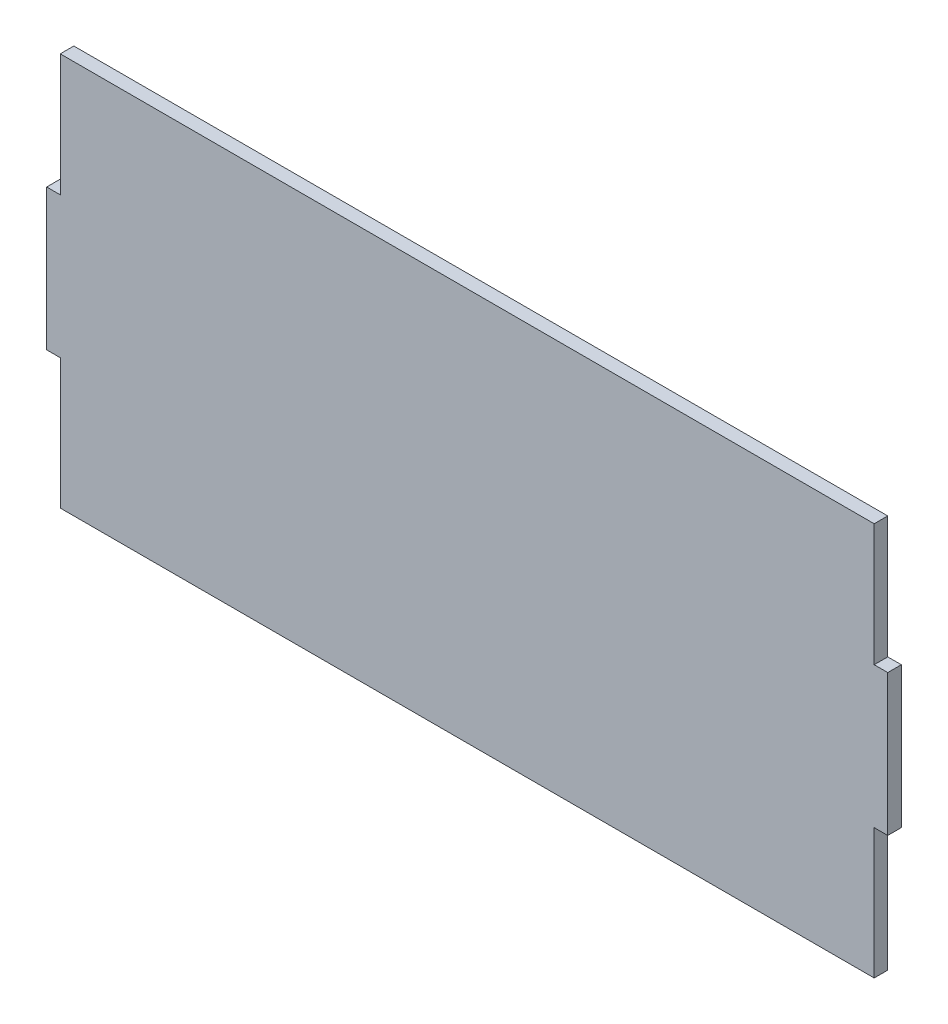
ISO-10303-21;
HEADER;
FILE_DESCRIPTION(('STEP AP214'),'2;1');
FILE_NAME('part.step','',(''),(''),'','','');
FILE_SCHEMA(('AUTOMOTIVE_DESIGN { 1 0 10303 214 1 1 1 1 }'));
ENDSEC;
DATA;
#1=APPLICATION_CONTEXT('core data for automotive mechanical design processes');
#2=APPLICATION_PROTOCOL_DEFINITION('international standard','automotive_design',2000,#1);
#3=PRODUCT_CONTEXT('',#1,'mechanical');
#4=PRODUCT('Part','Part','',(#3));
#5=PRODUCT_RELATED_PRODUCT_CATEGORY('part','',(#4));
#6=PRODUCT_DEFINITION_FORMATION('','',#4);
#7=PRODUCT_DEFINITION_CONTEXT('part definition',#1,'design');
#8=PRODUCT_DEFINITION('design','',#6,#7);
#9=PRODUCT_DEFINITION_SHAPE('','',#8);
#10=(LENGTH_UNIT() NAMED_UNIT(*) SI_UNIT(.MILLI.,.METRE.));
#11=(NAMED_UNIT(*) PLANE_ANGLE_UNIT() SI_UNIT($,.RADIAN.));
#12=(NAMED_UNIT(*) SI_UNIT($,.STERADIAN.) SOLID_ANGLE_UNIT());
#13=UNCERTAINTY_MEASURE_WITH_UNIT(LENGTH_MEASURE(1.E-05),#10,'distance_accuracy_value','');
#14=(GEOMETRIC_REPRESENTATION_CONTEXT(3) GLOBAL_UNCERTAINTY_ASSIGNED_CONTEXT((#13)) GLOBAL_UNIT_ASSIGNED_CONTEXT((#10,
#11,#12)) REPRESENTATION_CONTEXT('',''));
#15=CARTESIAN_POINT('',(0.,0.,0.));
#16=DIRECTION('',(0.,0.,1.));
#17=DIRECTION('',(1.,0.,0.));
#18=AXIS2_PLACEMENT_3D('',#15,#16,#17);
#19=CARTESIAN_POINT('',(0.,0.,5.));
#20=DIRECTION('',(-1.,0.,0.));
#21=DIRECTION('',(0.,-1.,0.));
#22=AXIS2_PLACEMENT_3D('',#19,#20,#21);
#23=PLANE('',#22);
#24=CARTESIAN_POINT('',(0.,-97.,5.));
#25=CARTESIAN_POINT('',(0.,-97.,0.));
#26=B_SPLINE_CURVE_WITH_KNOTS('',1,(#24,#25),.UNSPECIFIED.,.F.,.F.,(2,2),(0.,0.043859649122807),.UNSPECIFIED.);
#27=CARTESIAN_POINT('',(0.,-97.,5.));
#28=VERTEX_POINT('',#27);
#29=CARTESIAN_POINT('',(0.,-97.,0.));
#30=VERTEX_POINT('',#29);
#31=EDGE_CURVE('E103',#28,#30,#26,.T.);
#32=ORIENTED_EDGE('',*,*,#31,.F.);
#33=DIRECTION('',(0.,1.,0.));
#34=VECTOR('',#33,1.);
#35=CARTESIAN_POINT('',(0.,0.,5.));
#36=LINE('',#35,#34);
#37=CARTESIAN_POINT('',(0.,-145.,5.));
#38=VERTEX_POINT('',#37);
#39=EDGE_CURVE('E254',#38,#28,#36,.T.);
#40=ORIENTED_EDGE('',*,*,#39,.F.);
#41=DIRECTION('',(0.,0.,-1.));
#42=VECTOR('',#41,1.);
#43=CARTESIAN_POINT('',(0.,-145.,5.));
#44=LINE('',#43,#42);
#45=CARTESIAN_POINT('',(0.,-145.,0.));
#46=VERTEX_POINT('',#45);
#47=EDGE_CURVE('E265',#38,#46,#44,.T.);
#48=ORIENTED_EDGE('',*,*,#47,.T.);
#49=DIRECTION('',(0.,1.,0.));
#50=VECTOR('',#49,1.);
#51=CARTESIAN_POINT('',(0.,0.,0.));
#52=LINE('',#51,#50);
#53=EDGE_CURVE('E266',#46,#30,#52,.T.);
#54=ORIENTED_EDGE('',*,*,#53,.T.);
#55=EDGE_LOOP('',(#32,#40,#48,#54));
#56=FACE_BOUND('',#55,.T.);
#57=ADVANCED_FACE('F89',(#56),#23,.F.);
#58=CARTESIAN_POINT('',(0.,-45.,0.));
#59=CARTESIAN_POINT('',(0.,-45.,5.));
#60=B_SPLINE_CURVE_WITH_KNOTS('',1,(#58,#59),.UNSPECIFIED.,.F.,.F.,(2,2),(0.5,
0.543859649122807),.UNSPECIFIED.);
#61=CARTESIAN_POINT('',(0.,-45.,0.));
#62=VERTEX_POINT('',#61);
#63=CARTESIAN_POINT('',(0.,-45.,5.));
#64=VERTEX_POINT('',#63);
#65=EDGE_CURVE('E111',#62,#64,#60,.T.);
#66=ORIENTED_EDGE('',*,*,#65,.F.);
#67=CARTESIAN_POINT('',(0.,0.,0.));
#68=VERTEX_POINT('',#67);
#69=EDGE_CURVE('E226',#62,#68,#52,.T.);
#70=ORIENTED_EDGE('',*,*,#69,.T.);
#71=DIRECTION('',(0.,0.,-1.));
#72=VECTOR('',#71,1.);
#73=CARTESIAN_POINT('',(0.,0.,5.));
#74=LINE('',#73,#72);
#75=CARTESIAN_POINT('',(0.,0.,5.));
#76=VERTEX_POINT('',#75);
#77=EDGE_CURVE('E13',#76,#68,#74,.T.);
#78=ORIENTED_EDGE('',*,*,#77,.F.);
#79=EDGE_CURVE('E257',#64,#76,#36,.T.);
#80=ORIENTED_EDGE('',*,*,#79,.F.);
#81=EDGE_LOOP('',(#66,#70,#78,#80));
#82=FACE_BOUND('',#81,.T.);
#83=ADVANCED_FACE('F298',(#82),#23,.F.);
#84=CARTESIAN_POINT('',(-300.,0.,5.));
#85=DIRECTION('',(1.,0.,0.));
#86=DIRECTION('',(0.,1.,0.));
#87=AXIS2_PLACEMENT_3D('',#84,#85,#86);
#88=PLANE('',#87);
#89=CARTESIAN_POINT('',(-300.,-45.,5.));
#90=CARTESIAN_POINT('',(-300.,-45.,0.));
#91=B_SPLINE_CURVE_WITH_KNOTS('',1,(#89,#90),.UNSPECIFIED.,.F.,.F.,(2,2),(0.,0.043859649122807),.UNSPECIFIED.);
#92=CARTESIAN_POINT('',(-300.,-45.,5.));
#93=VERTEX_POINT('',#92);
#94=CARTESIAN_POINT('',(-300.,-45.,0.));
#95=VERTEX_POINT('',#94);
#96=EDGE_CURVE('E199',#93,#95,#91,.T.);
#97=ORIENTED_EDGE('',*,*,#96,.F.);
#98=DIRECTION('',(0.,-1.,0.));
#99=VECTOR('',#98,1.);
#100=CARTESIAN_POINT('',(-300.,0.,5.));
#101=LINE('',#100,#99);
#102=CARTESIAN_POINT('',(-300.,0.,5.));
#103=VERTEX_POINT('',#102);
#104=EDGE_CURVE('E260',#103,#93,#101,.T.);
#105=ORIENTED_EDGE('',*,*,#104,.F.);
#106=DIRECTION('',(0.,0.,-1.));
#107=VECTOR('',#106,1.);
#108=CARTESIAN_POINT('',(-300.,0.,5.));
#109=LINE('',#108,#107);
#110=CARTESIAN_POINT('',(-300.,0.,0.));
#111=VERTEX_POINT('',#110);
#112=EDGE_CURVE('E96',#103,#111,#109,.T.);
#113=ORIENTED_EDGE('',*,*,#112,.T.);
#114=DIRECTION('',(0.,-1.,0.));
#115=VECTOR('',#114,1.);
#116=CARTESIAN_POINT('',(-300.,0.,0.));
#117=LINE('',#116,#115);
#118=EDGE_CURVE('E271',#111,#95,#117,.T.);
#119=ORIENTED_EDGE('',*,*,#118,.T.);
#120=EDGE_LOOP('',(#97,#105,#113,#119));
#121=FACE_BOUND('',#120,.T.);
#122=ADVANCED_FACE('F284',(#121),#88,.F.);
#123=CARTESIAN_POINT('',(-300.,-97.,0.));
#124=CARTESIAN_POINT('',(-300.,-97.,5.));
#125=B_SPLINE_CURVE_WITH_KNOTS('',1,(#123,#124),.UNSPECIFIED.,.F.,.F.,(2,2),(0.5,
0.543859649122807),.UNSPECIFIED.);
#126=CARTESIAN_POINT('',(-300.,-97.,0.));
#127=VERTEX_POINT('',#126);
#128=CARTESIAN_POINT('',(-300.,-97.,5.));
#129=VERTEX_POINT('',#128);
#130=EDGE_CURVE('E202',#127,#129,#125,.T.);
#131=ORIENTED_EDGE('',*,*,#130,.F.);
#132=CARTESIAN_POINT('',(-300.,-145.,0.));
#133=VERTEX_POINT('',#132);
#134=EDGE_CURVE('E270',#127,#133,#117,.T.);
#135=ORIENTED_EDGE('',*,*,#134,.T.);
#136=DIRECTION('',(0.,0.,-1.));
#137=VECTOR('',#136,1.);
#138=CARTESIAN_POINT('',(-300.,-145.,5.));
#139=LINE('',#138,#137);
#140=CARTESIAN_POINT('',(-300.,-145.,5.));
#141=VERTEX_POINT('',#140);
#142=EDGE_CURVE('E277',#141,#133,#139,.T.);
#143=ORIENTED_EDGE('',*,*,#142,.F.);
#144=EDGE_CURVE('E259',#129,#141,#101,.T.);
#145=ORIENTED_EDGE('',*,*,#144,.F.);
#146=EDGE_LOOP('',(#131,#135,#143,#145));
#147=FACE_BOUND('',#146,.T.);
#148=ADVANCED_FACE('F322',(#147),#88,.F.);
#149=CARTESIAN_POINT('',(0.,0.,5.));
#150=DIRECTION('',(0.,-1.,0.));
#151=DIRECTION('',(0.,0.,-1.));
#152=AXIS2_PLACEMENT_3D('',#149,#150,#151);
#153=PLANE('',#152);
#154=DIRECTION('',(-1.,0.,0.));
#155=VECTOR('',#154,1.);
#156=CARTESIAN_POINT('',(0.,0.,0.));
#157=LINE('',#156,#155);
#158=EDGE_CURVE('E268',#68,#111,#157,.T.);
#159=ORIENTED_EDGE('',*,*,#158,.T.);
#160=ORIENTED_EDGE('',*,*,#112,.F.);
#161=DIRECTION('',(-1.,0.,0.));
#162=VECTOR('',#161,1.);
#163=CARTESIAN_POINT('',(0.,0.,5.));
#164=LINE('',#163,#162);
#165=EDGE_CURVE('E256',#76,#103,#164,.T.);
#166=ORIENTED_EDGE('',*,*,#165,.F.);
#167=ORIENTED_EDGE('',*,*,#77,.T.);
#168=EDGE_LOOP('',(#159,#160,#166,#167));
#169=FACE_BOUND('',#168,.T.);
#170=ADVANCED_FACE('F297',(#169),#153,.F.);
#171=CARTESIAN_POINT('',(0.,-145.,5.));
#172=DIRECTION('',(0.,1.,0.));
#173=DIRECTION('',(-1.,0.,0.));
#174=AXIS2_PLACEMENT_3D('',#171,#172,#173);
#175=PLANE('',#174);
#176=DIRECTION('',(1.,0.,0.));
#177=VECTOR('',#176,1.);
#178=CARTESIAN_POINT('',(0.,-145.,0.));
#179=LINE('',#178,#177);
#180=EDGE_CURVE('E273',#133,#46,#179,.T.);
#181=ORIENTED_EDGE('',*,*,#180,.T.);
#182=ORIENTED_EDGE('',*,*,#47,.F.);
#183=DIRECTION('',(1.,0.,0.));
#184=VECTOR('',#183,1.);
#185=CARTESIAN_POINT('',(0.,-145.,5.));
#186=LINE('',#185,#184);
#187=EDGE_CURVE('E263',#141,#38,#186,.T.);
#188=ORIENTED_EDGE('',*,*,#187,.F.);
#189=ORIENTED_EDGE('',*,*,#142,.T.);
#190=EDGE_LOOP('',(#181,#182,#188,#189));
#191=FACE_BOUND('',#190,.T.);
#192=ADVANCED_FACE('F330',(#191),#175,.F.);
#193=CARTESIAN_POINT('',(0.,0.,5.));
#194=DIRECTION('',(0.,0.,-1.));
#195=DIRECTION('',(-1.,0.,0.));
#196=AXIS2_PLACEMENT_3D('',#193,#194,#195);
#197=PLANE('',#196);
#198=ORIENTED_EDGE('',*,*,#39,.T.);
#199=DIRECTION('',(-1.,0.,0.));
#200=VECTOR('',#199,1.);
#201=CARTESIAN_POINT('',(9.99999999955322,-97.,5.));
#202=LINE('',#201,#200);
#203=CARTESIAN_POINT('',(5.00000000000207,-97.,5.));
#204=VERTEX_POINT('',#203);
#205=EDGE_CURVE('E190',#204,#28,#202,.T.);
#206=ORIENTED_EDGE('',*,*,#205,.F.);
#207=DIRECTION('',(0.,-1.,0.));
#208=VECTOR('',#207,1.);
#209=CARTESIAN_POINT('',(5.00000000000224,-45.,5.));
#210=LINE('',#209,#208);
#211=CARTESIAN_POINT('',(5.00000000000216,-45.,5.));
#212=VERTEX_POINT('',#211);
#213=EDGE_CURVE('E185',#212,#204,#210,.T.);
#214=ORIENTED_EDGE('',*,*,#213,.F.);
#215=DIRECTION('',(-1.,0.,0.));
#216=VECTOR('',#215,1.);
#217=CARTESIAN_POINT('',(9.99999999955322,-45.,5.));
#218=LINE('',#217,#216);
#219=EDGE_CURVE('E177',#212,#64,#218,.T.);
#220=ORIENTED_EDGE('',*,*,#219,.T.);
#221=ORIENTED_EDGE('',*,*,#79,.T.);
#222=ORIENTED_EDGE('',*,*,#165,.T.);
#223=ORIENTED_EDGE('',*,*,#104,.T.);
#224=DIRECTION('',(1.,0.,0.));
#225=VECTOR('',#224,1.);
#226=CARTESIAN_POINT('',(-309.999999999994,-45.,5.));
#227=LINE('',#226,#225);
#228=CARTESIAN_POINT('',(-304.999999999997,-45.,5.));
#229=VERTEX_POINT('',#228);
#230=EDGE_CURVE('E237',#229,#93,#227,.T.);
#231=ORIENTED_EDGE('',*,*,#230,.F.);
#232=DIRECTION('',(0.,-1.,0.));
#233=VECTOR('',#232,1.);
#234=CARTESIAN_POINT('',(-304.999999999997,-97.,5.));
#235=LINE('',#234,#233);
#236=CARTESIAN_POINT('',(-304.999999999997,-97.,5.));
#237=VERTEX_POINT('',#236);
#238=EDGE_CURVE('E221',#229,#237,#235,.T.);
#239=ORIENTED_EDGE('',*,*,#238,.T.);
#240=DIRECTION('',(1.,0.,0.));
#241=VECTOR('',#240,1.);
#242=CARTESIAN_POINT('',(-309.999999999994,-97.,5.));
#243=LINE('',#242,#241);
#244=EDGE_CURVE('E243',#237,#129,#243,.T.);
#245=ORIENTED_EDGE('',*,*,#244,.T.);
#246=ORIENTED_EDGE('',*,*,#144,.T.);
#247=ORIENTED_EDGE('',*,*,#187,.T.);
#248=EDGE_LOOP('',(#198,#206,#214,#220,#221,#222,#223,#231,#239,#245,#246,#247));
#249=FACE_BOUND('',#248,.T.);
#250=ADVANCED_FACE('F188',(#249),#197,.F.);
#251=CARTESIAN_POINT('',(0.,0.,0.));
#252=DIRECTION('',(0.,0.,-1.));
#253=DIRECTION('',(-1.,0.,0.));
#254=AXIS2_PLACEMENT_3D('',#251,#252,#253);
#255=PLANE('',#254);
#256=ORIENTED_EDGE('',*,*,#53,.F.);
#257=ORIENTED_EDGE('',*,*,#180,.F.);
#258=ORIENTED_EDGE('',*,*,#134,.F.);
#259=DIRECTION('',(1.,0.,0.));
#260=VECTOR('',#259,1.);
#261=CARTESIAN_POINT('',(-309.999999999994,-97.,0.));
#262=LINE('',#261,#260);
#263=CARTESIAN_POINT('',(-304.999999999997,-97.,0.));
#264=VERTEX_POINT('',#263);
#265=EDGE_CURVE('E246',#264,#127,#262,.T.);
#266=ORIENTED_EDGE('',*,*,#265,.F.);
#267=DIRECTION('',(0.,1.,0.));
#268=VECTOR('',#267,1.);
#269=CARTESIAN_POINT('',(-304.999999999997,-45.,0.));
#270=LINE('',#269,#268);
#271=CARTESIAN_POINT('',(-304.999999999997,-45.,0.));
#272=VERTEX_POINT('',#271);
#273=EDGE_CURVE('E220',#264,#272,#270,.T.);
#274=ORIENTED_EDGE('',*,*,#273,.T.);
#275=DIRECTION('',(1.,0.,0.));
#276=VECTOR('',#275,1.);
#277=CARTESIAN_POINT('',(-309.999999999994,-45.,0.));
#278=LINE('',#277,#276);
#279=EDGE_CURVE('E249',#272,#95,#278,.T.);
#280=ORIENTED_EDGE('',*,*,#279,.T.);
#281=ORIENTED_EDGE('',*,*,#118,.F.);
#282=ORIENTED_EDGE('',*,*,#158,.F.);
#283=ORIENTED_EDGE('',*,*,#69,.F.);
#284=DIRECTION('',(-1.,0.,0.));
#285=VECTOR('',#284,1.);
#286=CARTESIAN_POINT('',(9.99999999955322,-45.,0.));
#287=LINE('',#286,#285);
#288=CARTESIAN_POINT('',(5.00000000000224,-45.,0.));
#289=VERTEX_POINT('',#288);
#290=EDGE_CURVE('E214',#289,#62,#287,.T.);
#291=ORIENTED_EDGE('',*,*,#290,.F.);
#292=DIRECTION('',(0.,1.,0.));
#293=VECTOR('',#292,1.);
#294=CARTESIAN_POINT('',(5.00000000000207,-97.,0.));
#295=LINE('',#294,#293);
#296=CARTESIAN_POINT('',(5.00000000000216,-97.,0.));
#297=VERTEX_POINT('',#296);
#298=EDGE_CURVE('E198',#297,#289,#295,.T.);
#299=ORIENTED_EDGE('',*,*,#298,.F.);
#300=DIRECTION('',(-1.,0.,0.));
#301=VECTOR('',#300,1.);
#302=CARTESIAN_POINT('',(9.99999999955322,-97.,0.));
#303=LINE('',#302,#301);
#304=EDGE_CURVE('E211',#297,#30,#303,.T.);
#305=ORIENTED_EDGE('',*,*,#304,.T.);
#306=EDGE_LOOP('',(#256,#257,#258,#266,#274,#280,#281,#282,#283,#291,#299,#305));
#307=FACE_BOUND('',#306,.T.);
#308=ADVANCED_FACE('F290',(#307),#255,.T.);
#309=CARTESIAN_POINT('',(-309.999999999994,-97.,0.));
#310=DIRECTION('',(0.,1.,0.));
#311=DIRECTION('',(-1.,0.,0.));
#312=AXIS2_PLACEMENT_3D('',#309,#310,#311);
#313=PLANE('',#312);
#314=ORIENTED_EDGE('',*,*,#244,.F.);
#315=DIRECTION('',(0.,0.,-1.));
#316=VECTOR('',#315,1.);
#317=CARTESIAN_POINT('',(-304.999999999997,-97.,0.));
#318=LINE('',#317,#316);
#319=EDGE_CURVE('E217',#237,#264,#318,.T.);
#320=ORIENTED_EDGE('',*,*,#319,.T.);
#321=ORIENTED_EDGE('',*,*,#265,.T.);
#322=ORIENTED_EDGE('',*,*,#130,.T.);
#323=EDGE_LOOP('',(#314,#320,#321,#322));
#324=FACE_BOUND('',#323,.T.);
#325=ADVANCED_FACE('F348',(#324),#313,.F.);
#326=CARTESIAN_POINT('',(-309.999999999994,-45.,5.));
#327=DIRECTION('',(0.,-1.,0.));
#328=DIRECTION('',(1.,0.,0.));
#329=AXIS2_PLACEMENT_3D('',#326,#327,#328);
#330=PLANE('',#329);
#331=ORIENTED_EDGE('',*,*,#279,.F.);
#332=DIRECTION('',(0.,0.,1.));
#333=VECTOR('',#332,1.);
#334=CARTESIAN_POINT('',(-304.999999999997,-45.,5.));
#335=LINE('',#334,#333);
#336=EDGE_CURVE('E224',#272,#229,#335,.T.);
#337=ORIENTED_EDGE('',*,*,#336,.T.);
#338=ORIENTED_EDGE('',*,*,#230,.T.);
#339=ORIENTED_EDGE('',*,*,#96,.T.);
#340=EDGE_LOOP('',(#331,#337,#338,#339));
#341=FACE_BOUND('',#340,.T.);
#342=ADVANCED_FACE('F294',(#341),#330,.F.);
#343=CARTESIAN_POINT('',(-304.999999999997,-3.94129173741931E-12,299.999999999996));
#344=DIRECTION('',(1.,0.,0.));
#345=DIRECTION('',(0.,1.,0.));
#346=AXIS2_PLACEMENT_3D('',#343,#344,#345);
#347=PLANE('',#346);
#348=ORIENTED_EDGE('',*,*,#273,.F.);
#349=ORIENTED_EDGE('',*,*,#319,.F.);
#350=ORIENTED_EDGE('',*,*,#238,.F.);
#351=ORIENTED_EDGE('',*,*,#336,.F.);
#352=EDGE_LOOP('',(#348,#349,#350,#351));
#353=FACE_BOUND('',#352,.T.);
#354=ADVANCED_FACE('F303',(#353),#347,.F.);
#355=CARTESIAN_POINT('',(9.99999999955322,-97.,5.));
#356=DIRECTION('',(0.,1.,0.));
#357=DIRECTION('',(-1.,0.,0.));
#358=AXIS2_PLACEMENT_3D('',#355,#356,#357);
#359=PLANE('',#358);
#360=DIRECTION('',(0.,0.,-1.));
#361=VECTOR('',#360,1.);
#362=CARTESIAN_POINT('',(5.00000000000207,-97.,5.));
#363=LINE('',#362,#361);
#364=EDGE_CURVE('E194',#204,#297,#363,.T.);
#365=ORIENTED_EDGE('',*,*,#364,.F.);
#366=ORIENTED_EDGE('',*,*,#205,.T.);
#367=ORIENTED_EDGE('',*,*,#31,.T.);
#368=ORIENTED_EDGE('',*,*,#304,.F.);
#369=EDGE_LOOP('',(#365,#366,#367,#368));
#370=FACE_BOUND('',#369,.T.);
#371=ADVANCED_FACE('F301',(#370),#359,.F.);
#372=CARTESIAN_POINT('',(9.99999999955322,-45.,0.));
#373=DIRECTION('',(0.,-1.,0.));
#374=DIRECTION('',(1.,0.,0.));
#375=AXIS2_PLACEMENT_3D('',#372,#373,#374);
#376=PLANE('',#375);
#377=DIRECTION('',(0.,0.,1.));
#378=VECTOR('',#377,1.);
#379=CARTESIAN_POINT('',(5.00000000000224,-45.,0.));
#380=LINE('',#379,#378);
#381=EDGE_CURVE('E182',#289,#212,#380,.T.);
#382=ORIENTED_EDGE('',*,*,#381,.F.);
#383=ORIENTED_EDGE('',*,*,#290,.T.);
#384=ORIENTED_EDGE('',*,*,#65,.T.);
#385=ORIENTED_EDGE('',*,*,#219,.F.);
#386=EDGE_LOOP('',(#382,#383,#384,#385));
#387=FACE_BOUND('',#386,.T.);
#388=ADVANCED_FACE('F179',(#387),#376,.F.);
#389=CARTESIAN_POINT('',(5.00000000000242,-3.73562962286199E-12,299.999999999996));
#390=DIRECTION('',(1.,0.,0.));
#391=DIRECTION('',(0.,1.,0.));
#392=AXIS2_PLACEMENT_3D('',#389,#390,#391);
#393=PLANE('',#392);
#394=ORIENTED_EDGE('',*,*,#213,.T.);
#395=ORIENTED_EDGE('',*,*,#364,.T.);
#396=ORIENTED_EDGE('',*,*,#298,.T.);
#397=ORIENTED_EDGE('',*,*,#381,.T.);
#398=EDGE_LOOP('',(#394,#395,#396,#397));
#399=FACE_BOUND('',#398,.T.);
#400=ADVANCED_FACE('F197',(#399),#393,.T.);
#401=CLOSED_SHELL('',(#57,#83,#122,#148,#170,#192,#250,#308,#325,#342,#354,#371,#388,#400));
#402=MANIFOLD_SOLID_BREP('B2',#401);
#403=ADVANCED_BREP_SHAPE_REPRESENTATION('',(#18,#402),#14);
#404=SHAPE_DEFINITION_REPRESENTATION(#9,#403);
ENDSEC;
END-ISO-10303-21;
